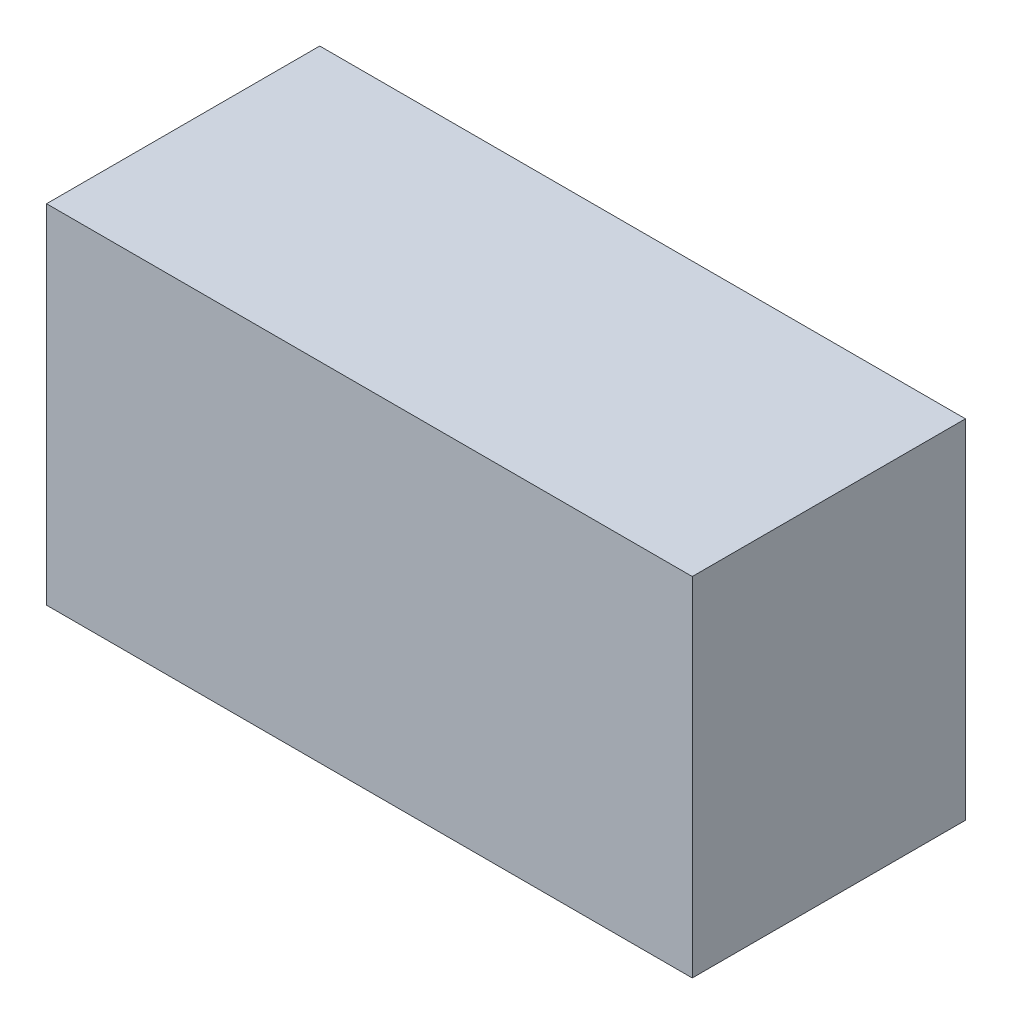
ISO-10303-21;
HEADER;
FILE_DESCRIPTION(('STEP AP214'),'2;1');
FILE_NAME('part.step','',(''),(''),'','','');
FILE_SCHEMA(('AUTOMOTIVE_DESIGN { 1 0 10303 214 1 1 1 1 }'));
ENDSEC;
DATA;
#1=APPLICATION_CONTEXT('core data for automotive mechanical design processes');
#2=APPLICATION_PROTOCOL_DEFINITION('international standard','automotive_design',2000,#1);
#3=PRODUCT_CONTEXT('',#1,'mechanical');
#4=PRODUCT('Part','Part','',(#3));
#5=PRODUCT_RELATED_PRODUCT_CATEGORY('part','',(#4));
#6=PRODUCT_DEFINITION_FORMATION('','',#4);
#7=PRODUCT_DEFINITION_CONTEXT('part definition',#1,'design');
#8=PRODUCT_DEFINITION('design','',#6,#7);
#9=PRODUCT_DEFINITION_SHAPE('','',#8);
#10=(LENGTH_UNIT() NAMED_UNIT(*) SI_UNIT(.MILLI.,.METRE.));
#11=(NAMED_UNIT(*) PLANE_ANGLE_UNIT() SI_UNIT($,.RADIAN.));
#12=(NAMED_UNIT(*) SI_UNIT($,.STERADIAN.) SOLID_ANGLE_UNIT());
#13=UNCERTAINTY_MEASURE_WITH_UNIT(LENGTH_MEASURE(1.E-05),#10,'distance_accuracy_value','');
#14=(GEOMETRIC_REPRESENTATION_CONTEXT(3) GLOBAL_UNCERTAINTY_ASSIGNED_CONTEXT((#13)) GLOBAL_UNIT_ASSIGNED_CONTEXT((#10,
#11,#12)) REPRESENTATION_CONTEXT('',''));
#15=CARTESIAN_POINT('',(0.,0.,0.));
#16=DIRECTION('',(0.,0.,1.));
#17=DIRECTION('',(1.,0.,0.));
#18=AXIS2_PLACEMENT_3D('',#15,#16,#17);
#19=CARTESIAN_POINT('',(0.,0.,0.55));
#20=DIRECTION('',(0.,0.,1.));
#21=DIRECTION('',(1.,0.,0.));
#22=AXIS2_PLACEMENT_3D('',#19,#20,#21);
#23=PLANE('',#22);
#24=DIRECTION('',(0.,1.,0.));
#25=VECTOR('',#24,1.);
#26=CARTESIAN_POINT('',(-0.65,0.35,0.55));
#27=LINE('',#26,#25);
#28=CARTESIAN_POINT('',(-0.65,-0.35,0.55));
#29=VERTEX_POINT('',#28);
#30=CARTESIAN_POINT('',(-0.65,0.35,0.55));
#31=VERTEX_POINT('',#30);
#32=EDGE_CURVE('E67',#29,#31,#27,.T.);
#33=ORIENTED_EDGE('',*,*,#32,.F.);
#34=DIRECTION('',(1.,0.,0.));
#35=VECTOR('',#34,1.);
#36=CARTESIAN_POINT('',(-0.65,-0.35,0.55));
#37=LINE('',#36,#35);
#38=CARTESIAN_POINT('',(0.65,-0.35,0.55));
#39=VERTEX_POINT('',#38);
#40=EDGE_CURVE('E19',#39,#29,#37,.F.);
#41=ORIENTED_EDGE('',*,*,#40,.F.);
#42=DIRECTION('',(0.,1.,0.));
#43=VECTOR('',#42,1.);
#44=CARTESIAN_POINT('',(0.65,-0.35,0.55));
#45=LINE('',#44,#43);
#46=CARTESIAN_POINT('',(0.65,0.35,0.55));
#47=VERTEX_POINT('',#46);
#48=EDGE_CURVE('E57',#47,#39,#45,.F.);
#49=ORIENTED_EDGE('',*,*,#48,.F.);
#50=DIRECTION('',(1.,0.,0.));
#51=VECTOR('',#50,1.);
#52=CARTESIAN_POINT('',(0.65,0.35,0.55));
#53=LINE('',#52,#51);
#54=EDGE_CURVE('E52',#31,#47,#53,.T.);
#55=ORIENTED_EDGE('',*,*,#54,.F.);
#56=EDGE_LOOP('',(#33,#41,#49,#55));
#57=FACE_BOUND('',#56,.T.);
#58=ADVANCED_FACE('F16',(#57),#23,.T.);
#59=CARTESIAN_POINT('',(-0.65,-0.35,0.));
#60=DIRECTION('',(0.,-1.,0.));
#61=DIRECTION('',(0.,0.,-1.));
#62=AXIS2_PLACEMENT_3D('',#59,#60,#61);
#63=PLANE('',#62);
#64=DIRECTION('',(0.,0.,1.));
#65=VECTOR('',#64,1.);
#66=CARTESIAN_POINT('',(-0.65,-0.35,0.));
#67=LINE('',#66,#65);
#68=CARTESIAN_POINT('',(-0.65,-0.35,0.));
#69=VERTEX_POINT('',#68);
#70=EDGE_CURVE('E78',#69,#29,#67,.T.);
#71=ORIENTED_EDGE('',*,*,#70,.F.);
#72=DIRECTION('',(1.,0.,0.));
#73=VECTOR('',#72,1.);
#74=CARTESIAN_POINT('',(0.,-0.35,0.));
#75=LINE('',#74,#73);
#76=CARTESIAN_POINT('',(0.65,-0.35,0.));
#77=VERTEX_POINT('',#76);
#78=EDGE_CURVE('E73',#69,#77,#75,.T.);
#79=ORIENTED_EDGE('',*,*,#78,.T.);
#80=DIRECTION('',(0.,0.,-1.));
#81=VECTOR('',#80,1.);
#82=CARTESIAN_POINT('',(0.65,-0.35,0.));
#83=LINE('',#82,#81);
#84=EDGE_CURVE('E62',#39,#77,#83,.T.);
#85=ORIENTED_EDGE('',*,*,#84,.F.);
#86=ORIENTED_EDGE('',*,*,#40,.T.);
#87=EDGE_LOOP('',(#71,#79,#85,#86));
#88=FACE_BOUND('',#87,.T.);
#89=ADVANCED_FACE('F72',(#88),#63,.T.);
#90=CARTESIAN_POINT('',(0.65,-0.35,0.));
#91=DIRECTION('',(1.,0.,0.));
#92=DIRECTION('',(0.,0.,-1.));
#93=AXIS2_PLACEMENT_3D('',#90,#91,#92);
#94=PLANE('',#93);
#95=ORIENTED_EDGE('',*,*,#84,.T.);
#96=DIRECTION('',(0.,1.,0.));
#97=VECTOR('',#96,1.);
#98=CARTESIAN_POINT('',(0.65,0.,0.));
#99=LINE('',#98,#97);
#100=CARTESIAN_POINT('',(0.65,0.35,0.));
#101=VERTEX_POINT('',#100);
#102=EDGE_CURVE('E83',#77,#101,#99,.T.);
#103=ORIENTED_EDGE('',*,*,#102,.T.);
#104=DIRECTION('',(0.,0.,1.));
#105=VECTOR('',#104,1.);
#106=CARTESIAN_POINT('',(0.65,0.35,0.));
#107=LINE('',#106,#105);
#108=EDGE_CURVE('E64',#47,#101,#107,.F.);
#109=ORIENTED_EDGE('',*,*,#108,.F.);
#110=ORIENTED_EDGE('',*,*,#48,.T.);
#111=EDGE_LOOP('',(#95,#103,#109,#110));
#112=FACE_BOUND('',#111,.T.);
#113=ADVANCED_FACE('F59',(#112),#94,.T.);
#114=CARTESIAN_POINT('',(0.65,0.35,0.));
#115=DIRECTION('',(0.,1.,0.));
#116=DIRECTION('',(0.,0.,1.));
#117=AXIS2_PLACEMENT_3D('',#114,#115,#116);
#118=PLANE('',#117);
#119=ORIENTED_EDGE('',*,*,#108,.T.);
#120=DIRECTION('',(1.,0.,0.));
#121=VECTOR('',#120,1.);
#122=CARTESIAN_POINT('',(0.,0.35,0.));
#123=LINE('',#122,#121);
#124=CARTESIAN_POINT('',(-0.65,0.35,0.));
#125=VERTEX_POINT('',#124);
#126=EDGE_CURVE('E25',#101,#125,#123,.F.);
#127=ORIENTED_EDGE('',*,*,#126,.T.);
#128=DIRECTION('',(0.,0.,1.));
#129=VECTOR('',#128,1.);
#130=CARTESIAN_POINT('',(-0.65,0.35,0.));
#131=LINE('',#130,#129);
#132=EDGE_CURVE('E33',#31,#125,#131,.F.);
#133=ORIENTED_EDGE('',*,*,#132,.F.);
#134=ORIENTED_EDGE('',*,*,#54,.T.);
#135=EDGE_LOOP('',(#119,#127,#133,#134));
#136=FACE_BOUND('',#135,.T.);
#137=ADVANCED_FACE('F87',(#136),#118,.T.);
#138=CARTESIAN_POINT('',(-0.65,0.35,0.));
#139=DIRECTION('',(-1.,0.,0.));
#140=DIRECTION('',(0.,0.,1.));
#141=AXIS2_PLACEMENT_3D('',#138,#139,#140);
#142=PLANE('',#141);
#143=ORIENTED_EDGE('',*,*,#132,.T.);
#144=DIRECTION('',(0.,1.,0.));
#145=VECTOR('',#144,1.);
#146=CARTESIAN_POINT('',(-0.65,0.,0.));
#147=LINE('',#146,#145);
#148=EDGE_CURVE('E11',#125,#69,#147,.F.);
#149=ORIENTED_EDGE('',*,*,#148,.T.);
#150=ORIENTED_EDGE('',*,*,#70,.T.);
#151=ORIENTED_EDGE('',*,*,#32,.T.);
#152=EDGE_LOOP('',(#143,#149,#150,#151));
#153=FACE_BOUND('',#152,.T.);
#154=ADVANCED_FACE('F90',(#153),#142,.T.);
#155=CARTESIAN_POINT('',(0.,0.,0.));
#156=DIRECTION('',(0.,0.,1.));
#157=DIRECTION('',(1.,0.,0.));
#158=AXIS2_PLACEMENT_3D('',#155,#156,#157);
#159=PLANE('',#158);
#160=ORIENTED_EDGE('',*,*,#126,.F.);
#161=ORIENTED_EDGE('',*,*,#102,.F.);
#162=ORIENTED_EDGE('',*,*,#78,.F.);
#163=ORIENTED_EDGE('',*,*,#148,.F.);
#164=EDGE_LOOP('',(#160,#161,#162,#163));
#165=FACE_BOUND('',#164,.T.);
#166=ADVANCED_FACE('F89',(#165),#159,.F.);
#167=CLOSED_SHELL('',(#58,#89,#113,#137,#154,#166));
#168=MANIFOLD_SOLID_BREP('B1',#167);
#169=ADVANCED_BREP_SHAPE_REPRESENTATION('',(#18,#168),#14);
#170=SHAPE_DEFINITION_REPRESENTATION(#9,#169);
ENDSEC;
END-ISO-10303-21;
